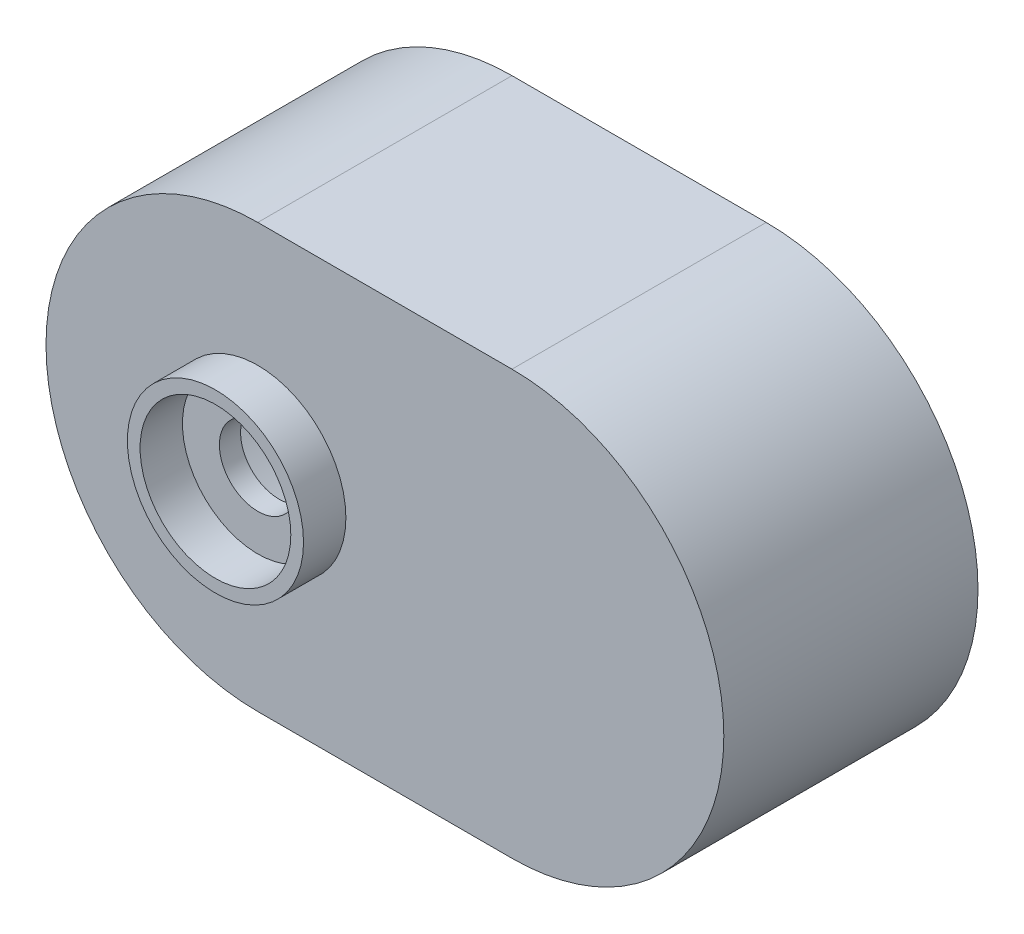
ISO-10303-21;
HEADER;
FILE_DESCRIPTION(('STEP AP214'),'2;1');
FILE_NAME('part.step','',(''),(''),'','','');
FILE_SCHEMA(('AUTOMOTIVE_DESIGN { 1 0 10303 214 1 1 1 1 }'));
ENDSEC;
DATA;
#1=APPLICATION_CONTEXT('core data for automotive mechanical design processes');
#2=APPLICATION_PROTOCOL_DEFINITION('international standard','automotive_design',2000,#1);
#3=PRODUCT_CONTEXT('',#1,'mechanical');
#4=PRODUCT('Part','Part','',(#3));
#5=PRODUCT_RELATED_PRODUCT_CATEGORY('part','',(#4));
#6=PRODUCT_DEFINITION_FORMATION('','',#4);
#7=PRODUCT_DEFINITION_CONTEXT('part definition',#1,'design');
#8=PRODUCT_DEFINITION('design','',#6,#7);
#9=PRODUCT_DEFINITION_SHAPE('','',#8);
#10=(LENGTH_UNIT() NAMED_UNIT(*) SI_UNIT(.MILLI.,.METRE.));
#11=(NAMED_UNIT(*) PLANE_ANGLE_UNIT() SI_UNIT($,.RADIAN.));
#12=(NAMED_UNIT(*) SI_UNIT($,.STERADIAN.) SOLID_ANGLE_UNIT());
#13=UNCERTAINTY_MEASURE_WITH_UNIT(LENGTH_MEASURE(1.E-05),#10,'distance_accuracy_value','');
#14=(GEOMETRIC_REPRESENTATION_CONTEXT(3) GLOBAL_UNCERTAINTY_ASSIGNED_CONTEXT((#13)) GLOBAL_UNIT_ASSIGNED_CONTEXT((#10,
#11,#12)) REPRESENTATION_CONTEXT('',''));
#15=CARTESIAN_POINT('',(0.,0.,0.));
#16=DIRECTION('',(0.,0.,1.));
#17=DIRECTION('',(1.,0.,0.));
#18=AXIS2_PLACEMENT_3D('',#15,#16,#17);
#19=CARTESIAN_POINT('',(0.,0.,60.));
#20=DIRECTION('',(0.,0.,-1.));
#21=DIRECTION('',(-1.,0.,0.));
#22=AXIS2_PLACEMENT_3D('',#19,#20,#21);
#23=CYLINDRICAL_SURFACE('',#22,50.);
#24=CARTESIAN_POINT('',(0.,0.,0.));
#25=DIRECTION('',(0.,0.,1.));
#26=DIRECTION('',(1.,0.,0.));
#27=AXIS2_PLACEMENT_3D('',#24,#25,#26);
#28=CIRCLE('',#27,50.);
#29=CARTESIAN_POINT('',(0.,50.,0.));
#30=VERTEX_POINT('',#29);
#31=CARTESIAN_POINT('',(0.,-50.,0.));
#32=VERTEX_POINT('',#31);
#33=EDGE_CURVE('E170',#30,#32,#28,.T.);
#34=ORIENTED_EDGE('',*,*,#33,.T.);
#35=DIRECTION('',(0.,0.,-1.));
#36=VECTOR('',#35,1.);
#37=CARTESIAN_POINT('',(0.,-50.,60.));
#38=LINE('',#37,#36);
#39=CARTESIAN_POINT('',(0.,-50.,60.));
#40=VERTEX_POINT('',#39);
#41=EDGE_CURVE('E54',#40,#32,#38,.T.);
#42=ORIENTED_EDGE('',*,*,#41,.F.);
#43=CARTESIAN_POINT('',(0.,0.,60.));
#44=DIRECTION('',(0.,0.,1.));
#45=DIRECTION('',(1.,0.,0.));
#46=AXIS2_PLACEMENT_3D('',#43,#44,#45);
#47=CIRCLE('',#46,50.);
#48=CARTESIAN_POINT('',(0.,50.,60.));
#49=VERTEX_POINT('',#48);
#50=EDGE_CURVE('E176',#49,#40,#47,.T.);
#51=ORIENTED_EDGE('',*,*,#50,.F.);
#52=DIRECTION('',(0.,0.,-1.));
#53=VECTOR('',#52,1.);
#54=CARTESIAN_POINT('',(0.,50.,60.));
#55=LINE('',#54,#53);
#56=EDGE_CURVE('E186',#49,#30,#55,.T.);
#57=ORIENTED_EDGE('',*,*,#56,.T.);
#58=EDGE_LOOP('',(#34,#42,#51,#57));
#59=FACE_BOUND('',#58,.T.);
#60=ADVANCED_FACE('F45',(#59),#23,.T.);
#61=CARTESIAN_POINT('',(0.,-50.,60.));
#62=DIRECTION('',(0.,1.,0.));
#63=DIRECTION('',(0.,0.,1.));
#64=AXIS2_PLACEMENT_3D('',#61,#62,#63);
#65=PLANE('',#64);
#66=DIRECTION('',(1.,0.,0.));
#67=VECTOR('',#66,1.);
#68=CARTESIAN_POINT('',(0.,-50.,0.));
#69=LINE('',#68,#67);
#70=CARTESIAN_POINT('',(60.,-50.,0.));
#71=VERTEX_POINT('',#70);
#72=EDGE_CURVE('E190',#32,#71,#69,.T.);
#73=ORIENTED_EDGE('',*,*,#72,.T.);
#74=DIRECTION('',(0.,0.,-1.));
#75=VECTOR('',#74,1.);
#76=CARTESIAN_POINT('',(60.,-50.,60.));
#77=LINE('',#76,#75);
#78=CARTESIAN_POINT('',(60.,-50.,60.));
#79=VERTEX_POINT('',#78);
#80=EDGE_CURVE('E203',#79,#71,#77,.T.);
#81=ORIENTED_EDGE('',*,*,#80,.F.);
#82=DIRECTION('',(1.,0.,0.));
#83=VECTOR('',#82,1.);
#84=CARTESIAN_POINT('',(0.,-50.,60.));
#85=LINE('',#84,#83);
#86=EDGE_CURVE('E99',#40,#79,#85,.T.);
#87=ORIENTED_EDGE('',*,*,#86,.F.);
#88=ORIENTED_EDGE('',*,*,#41,.T.);
#89=EDGE_LOOP('',(#73,#81,#87,#88));
#90=FACE_BOUND('',#89,.T.);
#91=ADVANCED_FACE('F209',(#90),#65,.F.);
#92=CARTESIAN_POINT('',(60.,0.,60.));
#93=DIRECTION('',(0.,0.,-1.));
#94=DIRECTION('',(-1.,0.,0.));
#95=AXIS2_PLACEMENT_3D('',#92,#93,#94);
#96=CYLINDRICAL_SURFACE('',#95,50.);
#97=CARTESIAN_POINT('',(60.,0.,0.));
#98=DIRECTION('',(0.,0.,1.));
#99=DIRECTION('',(1.,0.,0.));
#100=AXIS2_PLACEMENT_3D('',#97,#98,#99);
#101=CIRCLE('',#100,50.);
#102=CARTESIAN_POINT('',(60.,50.,0.));
#103=VERTEX_POINT('',#102);
#104=EDGE_CURVE('E193',#71,#103,#101,.T.);
#105=ORIENTED_EDGE('',*,*,#104,.T.);
#106=DIRECTION('',(0.,0.,-1.));
#107=VECTOR('',#106,1.);
#108=CARTESIAN_POINT('',(60.,50.,60.));
#109=LINE('',#108,#107);
#110=CARTESIAN_POINT('',(60.,50.,60.));
#111=VERTEX_POINT('',#110);
#112=EDGE_CURVE('E200',#111,#103,#109,.T.);
#113=ORIENTED_EDGE('',*,*,#112,.F.);
#114=CARTESIAN_POINT('',(60.,0.,60.));
#115=DIRECTION('',(0.,0.,1.));
#116=DIRECTION('',(1.,0.,0.));
#117=AXIS2_PLACEMENT_3D('',#114,#115,#116);
#118=CIRCLE('',#117,50.);
#119=EDGE_CURVE('E181',#79,#111,#118,.T.);
#120=ORIENTED_EDGE('',*,*,#119,.F.);
#121=ORIENTED_EDGE('',*,*,#80,.T.);
#122=EDGE_LOOP('',(#105,#113,#120,#121));
#123=FACE_BOUND('',#122,.T.);
#124=ADVANCED_FACE('F218',(#123),#96,.T.);
#125=CARTESIAN_POINT('',(0.,50.,60.));
#126=DIRECTION('',(0.,-1.,0.));
#127=DIRECTION('',(0.,0.,-1.));
#128=AXIS2_PLACEMENT_3D('',#125,#126,#127);
#129=PLANE('',#128);
#130=DIRECTION('',(-1.,0.,0.));
#131=VECTOR('',#130,1.);
#132=CARTESIAN_POINT('',(0.,50.,0.));
#133=LINE('',#132,#131);
#134=EDGE_CURVE('E91',#103,#30,#133,.T.);
#135=ORIENTED_EDGE('',*,*,#134,.T.);
#136=ORIENTED_EDGE('',*,*,#56,.F.);
#137=DIRECTION('',(-1.,0.,0.));
#138=VECTOR('',#137,1.);
#139=CARTESIAN_POINT('',(0.,50.,60.));
#140=LINE('',#139,#138);
#141=EDGE_CURVE('E70',#111,#49,#140,.T.);
#142=ORIENTED_EDGE('',*,*,#141,.F.);
#143=ORIENTED_EDGE('',*,*,#112,.T.);
#144=EDGE_LOOP('',(#135,#136,#142,#143));
#145=FACE_BOUND('',#144,.T.);
#146=ADVANCED_FACE('F220',(#145),#129,.F.);
#147=CARTESIAN_POINT('',(0.,0.,60.));
#148=DIRECTION('',(0.,0.,1.));
#149=DIRECTION('',(1.,0.,0.));
#150=AXIS2_PLACEMENT_3D('',#147,#148,#149);
#151=PLANE('',#150);
#152=CARTESIAN_POINT('',(0.,0.,60.));
#153=DIRECTION('',(0.,0.,1.));
#154=DIRECTION('',(1.,0.,0.));
#155=AXIS2_PLACEMENT_3D('',#152,#153,#154);
#156=CIRCLE('',#155,20.7891455542348);
#157=CARTESIAN_POINT('',(20.7891455542348,0.,60.));
#158=VERTEX_POINT('',#157);
#159=EDGE_CURVE('E151',#158,#158,#156,.T.);
#160=ORIENTED_EDGE('',*,*,#159,.F.);
#161=EDGE_LOOP('',(#160));
#162=FACE_BOUND('',#161,.T.);
#163=ORIENTED_EDGE('',*,*,#50,.T.);
#164=ORIENTED_EDGE('',*,*,#86,.T.);
#165=ORIENTED_EDGE('',*,*,#119,.T.);
#166=ORIENTED_EDGE('',*,*,#141,.T.);
#167=EDGE_LOOP('',(#163,#164,#165,#166));
#168=FACE_BOUND('',#167,.T.);
#169=ADVANCED_FACE('F221',(#162,#168),#151,.T.);
#170=CARTESIAN_POINT('',(0.,0.,0.));
#171=DIRECTION('',(0.,0.,1.));
#172=DIRECTION('',(1.,0.,0.));
#173=AXIS2_PLACEMENT_3D('',#170,#171,#172);
#174=PLANE('',#173);
#175=CARTESIAN_POINT('',(0.,0.,0.));
#176=DIRECTION('',(0.,0.,-1.));
#177=DIRECTION('',(-1.,0.,0.));
#178=AXIS2_PLACEMENT_3D('',#175,#176,#177);
#179=CIRCLE('',#178,47.);
#180=CARTESIAN_POINT('',(0.,-47.,0.));
#181=VERTEX_POINT('',#180);
#182=CARTESIAN_POINT('',(0.,47.,0.));
#183=VERTEX_POINT('',#182);
#184=EDGE_CURVE('E160',#181,#183,#179,.T.);
#185=ORIENTED_EDGE('',*,*,#184,.F.);
#186=DIRECTION('',(-1.,0.,0.));
#187=VECTOR('',#186,1.);
#188=CARTESIAN_POINT('',(0.,-47.,0.));
#189=LINE('',#188,#187);
#190=CARTESIAN_POINT('',(60.,-47.,0.));
#191=VERTEX_POINT('',#190);
#192=EDGE_CURVE('E61',#191,#181,#189,.T.);
#193=ORIENTED_EDGE('',*,*,#192,.F.);
#194=CARTESIAN_POINT('',(60.,0.,0.));
#195=DIRECTION('',(0.,0.,-1.));
#196=DIRECTION('',(-1.,0.,0.));
#197=AXIS2_PLACEMENT_3D('',#194,#195,#196);
#198=CIRCLE('',#197,47.);
#199=CARTESIAN_POINT('',(60.,47.,0.));
#200=VERTEX_POINT('',#199);
#201=EDGE_CURVE('E144',#200,#191,#198,.T.);
#202=ORIENTED_EDGE('',*,*,#201,.F.);
#203=DIRECTION('',(1.,0.,0.));
#204=VECTOR('',#203,1.);
#205=CARTESIAN_POINT('',(0.,47.,0.));
#206=LINE('',#205,#204);
#207=EDGE_CURVE('E148',#183,#200,#206,.T.);
#208=ORIENTED_EDGE('',*,*,#207,.F.);
#209=EDGE_LOOP('',(#185,#193,#202,#208));
#210=FACE_BOUND('',#209,.T.);
#211=ORIENTED_EDGE('',*,*,#33,.F.);
#212=ORIENTED_EDGE('',*,*,#134,.F.);
#213=ORIENTED_EDGE('',*,*,#104,.F.);
#214=ORIENTED_EDGE('',*,*,#72,.F.);
#215=EDGE_LOOP('',(#211,#212,#213,#214));
#216=FACE_BOUND('',#215,.T.);
#217=ADVANCED_FACE('F214',(#210,#216),#174,.F.);
#218=CARTESIAN_POINT('',(0.,-47.,55.));
#219=DIRECTION('',(0.,-1.,0.));
#220=DIRECTION('',(0.,0.,-1.));
#221=AXIS2_PLACEMENT_3D('',#218,#219,#220);
#222=PLANE('',#221);
#223=ORIENTED_EDGE('',*,*,#192,.T.);
#224=DIRECTION('',(0.,0.,-1.));
#225=VECTOR('',#224,1.);
#226=CARTESIAN_POINT('',(0.,-47.,55.));
#227=LINE('',#226,#225);
#228=CARTESIAN_POINT('',(0.,-47.,55.));
#229=VERTEX_POINT('',#228);
#230=EDGE_CURVE('E119',#229,#181,#227,.T.);
#231=ORIENTED_EDGE('',*,*,#230,.F.);
#232=DIRECTION('',(-1.,0.,0.));
#233=VECTOR('',#232,1.);
#234=CARTESIAN_POINT('',(0.,-47.,55.));
#235=LINE('',#234,#233);
#236=CARTESIAN_POINT('',(60.,-47.,55.));
#237=VERTEX_POINT('',#236);
#238=EDGE_CURVE('E123',#237,#229,#235,.T.);
#239=ORIENTED_EDGE('',*,*,#238,.F.);
#240=DIRECTION('',(0.,0.,-1.));
#241=VECTOR('',#240,1.);
#242=CARTESIAN_POINT('',(60.,-47.,55.));
#243=LINE('',#242,#241);
#244=EDGE_CURVE('E167',#237,#191,#243,.T.);
#245=ORIENTED_EDGE('',*,*,#244,.T.);
#246=EDGE_LOOP('',(#223,#231,#239,#245));
#247=FACE_BOUND('',#246,.T.);
#248=ADVANCED_FACE('F121',(#247),#222,.F.);
#249=CARTESIAN_POINT('',(60.,0.,55.));
#250=DIRECTION('',(0.,0.,-1.));
#251=DIRECTION('',(-1.,0.,0.));
#252=AXIS2_PLACEMENT_3D('',#249,#250,#251);
#253=CYLINDRICAL_SURFACE('',#252,47.);
#254=ORIENTED_EDGE('',*,*,#201,.T.);
#255=ORIENTED_EDGE('',*,*,#244,.F.);
#256=CARTESIAN_POINT('',(60.,0.,55.));
#257=DIRECTION('',(0.,0.,-1.));
#258=DIRECTION('',(-1.,0.,0.));
#259=AXIS2_PLACEMENT_3D('',#256,#257,#258);
#260=CIRCLE('',#259,47.);
#261=CARTESIAN_POINT('',(60.,47.,55.));
#262=VERTEX_POINT('',#261);
#263=EDGE_CURVE('E130',#262,#237,#260,.T.);
#264=ORIENTED_EDGE('',*,*,#263,.F.);
#265=DIRECTION('',(0.,0.,-1.));
#266=VECTOR('',#265,1.);
#267=CARTESIAN_POINT('',(60.,47.,55.));
#268=LINE('',#267,#266);
#269=EDGE_CURVE('E171',#262,#200,#268,.T.);
#270=ORIENTED_EDGE('',*,*,#269,.T.);
#271=EDGE_LOOP('',(#254,#255,#264,#270));
#272=FACE_BOUND('',#271,.T.);
#273=ADVANCED_FACE('F271',(#272),#253,.F.);
#274=CARTESIAN_POINT('',(0.,47.,55.));
#275=DIRECTION('',(0.,1.,0.));
#276=DIRECTION('',(0.,0.,1.));
#277=AXIS2_PLACEMENT_3D('',#274,#275,#276);
#278=PLANE('',#277);
#279=ORIENTED_EDGE('',*,*,#207,.T.);
#280=ORIENTED_EDGE('',*,*,#269,.F.);
#281=DIRECTION('',(1.,0.,0.));
#282=VECTOR('',#281,1.);
#283=CARTESIAN_POINT('',(0.,47.,55.));
#284=LINE('',#283,#282);
#285=CARTESIAN_POINT('',(0.,47.,55.));
#286=VERTEX_POINT('',#285);
#287=EDGE_CURVE('E139',#286,#262,#284,.T.);
#288=ORIENTED_EDGE('',*,*,#287,.F.);
#289=DIRECTION('',(0.,0.,-1.));
#290=VECTOR('',#289,1.);
#291=CARTESIAN_POINT('',(0.,47.,55.));
#292=LINE('',#291,#290);
#293=EDGE_CURVE('E129',#286,#183,#292,.T.);
#294=ORIENTED_EDGE('',*,*,#293,.T.);
#295=EDGE_LOOP('',(#279,#280,#288,#294));
#296=FACE_BOUND('',#295,.T.);
#297=ADVANCED_FACE('F280',(#296),#278,.F.);
#298=CARTESIAN_POINT('',(0.,0.,55.));
#299=DIRECTION('',(0.,0.,-1.));
#300=DIRECTION('',(-1.,0.,0.));
#301=AXIS2_PLACEMENT_3D('',#298,#299,#300);
#302=CYLINDRICAL_SURFACE('',#301,47.);
#303=ORIENTED_EDGE('',*,*,#184,.T.);
#304=ORIENTED_EDGE('',*,*,#293,.F.);
#305=CARTESIAN_POINT('',(0.,0.,55.));
#306=DIRECTION('',(0.,0.,-1.));
#307=DIRECTION('',(-1.,0.,0.));
#308=AXIS2_PLACEMENT_3D('',#305,#306,#307);
#309=CIRCLE('',#308,47.);
#310=EDGE_CURVE('E133',#229,#286,#309,.T.);
#311=ORIENTED_EDGE('',*,*,#310,.F.);
#312=ORIENTED_EDGE('',*,*,#230,.T.);
#313=EDGE_LOOP('',(#303,#304,#311,#312));
#314=FACE_BOUND('',#313,.T.);
#315=ADVANCED_FACE('F134',(#314),#302,.F.);
#316=CARTESIAN_POINT('',(0.,0.,55.));
#317=DIRECTION('',(0.,0.,-1.));
#318=DIRECTION('',(-1.,0.,0.));
#319=AXIS2_PLACEMENT_3D('',#316,#317,#318);
#320=PLANE('',#319);
#321=CARTESIAN_POINT('',(0.,0.,55.));
#322=DIRECTION('',(0.,0.,-1.));
#323=DIRECTION('',(-1.,0.,0.));
#324=AXIS2_PLACEMENT_3D('',#321,#322,#323);
#325=CIRCLE('',#324,9.07220859637889);
#326=CARTESIAN_POINT('',(-9.07220859637889,0.,55.));
#327=VERTEX_POINT('',#326);
#328=EDGE_CURVE('E48',#327,#327,#325,.T.);
#329=ORIENTED_EDGE('',*,*,#328,.F.);
#330=EDGE_LOOP('',(#329));
#331=FACE_BOUND('',#330,.T.);
#332=ORIENTED_EDGE('',*,*,#238,.T.);
#333=ORIENTED_EDGE('',*,*,#310,.T.);
#334=ORIENTED_EDGE('',*,*,#287,.T.);
#335=ORIENTED_EDGE('',*,*,#263,.T.);
#336=EDGE_LOOP('',(#332,#333,#334,#335));
#337=FACE_BOUND('',#336,.T.);
#338=ADVANCED_FACE('F141',(#331,#337),#320,.T.);
#339=CARTESIAN_POINT('',(0.,0.,70.));
#340=DIRECTION('',(0.,0.,-1.));
#341=DIRECTION('',(-1.,0.,0.));
#342=AXIS2_PLACEMENT_3D('',#339,#340,#341);
#343=CYLINDRICAL_SURFACE('',#342,17.7891455542348);
#344=CARTESIAN_POINT('',(0.,0.,70.));
#345=DIRECTION('',(0.,0.,1.));
#346=DIRECTION('',(1.,0.,0.));
#347=AXIS2_PLACEMENT_3D('',#344,#345,#346);
#348=CIRCLE('',#347,17.7891455542348);
#349=CARTESIAN_POINT('',(17.7891455542348,0.,70.));
#350=VERTEX_POINT('',#349);
#351=EDGE_CURVE('E407',#350,#350,#348,.T.);
#352=ORIENTED_EDGE('',*,*,#351,.T.);
#353=EDGE_LOOP('',(#352));
#354=FACE_BOUND('',#353,.T.);
#355=CARTESIAN_POINT('',(0.,0.,60.));
#356=DIRECTION('',(0.,0.,1.));
#357=DIRECTION('',(1.,0.,0.));
#358=AXIS2_PLACEMENT_3D('',#355,#356,#357);
#359=CIRCLE('',#358,17.7891455542348);
#360=CARTESIAN_POINT('',(17.7891455542348,0.,60.));
#361=VERTEX_POINT('',#360);
#362=EDGE_CURVE('E11',#361,#361,#359,.F.);
#363=ORIENTED_EDGE('',*,*,#362,.T.);
#364=EDGE_LOOP('',(#363));
#365=FACE_BOUND('',#364,.T.);
#366=ADVANCED_FACE('F312',(#354,#365),#343,.F.);
#367=CARTESIAN_POINT('',(0.,0.,70.));
#368=DIRECTION('',(0.,0.,-1.));
#369=DIRECTION('',(-1.,0.,0.));
#370=AXIS2_PLACEMENT_3D('',#367,#368,#369);
#371=CYLINDRICAL_SURFACE('',#370,20.7891455542348);
#372=CARTESIAN_POINT('',(0.,0.,70.));
#373=DIRECTION('',(0.,0.,1.));
#374=DIRECTION('',(1.,0.,0.));
#375=AXIS2_PLACEMENT_3D('',#372,#373,#374);
#376=CIRCLE('',#375,20.7891455542348);
#377=CARTESIAN_POINT('',(20.7891455542348,0.,70.));
#378=VERTEX_POINT('',#377);
#379=EDGE_CURVE('E161',#378,#378,#376,.T.);
#380=ORIENTED_EDGE('',*,*,#379,.F.);
#381=EDGE_LOOP('',(#380));
#382=FACE_BOUND('',#381,.T.);
#383=ORIENTED_EDGE('',*,*,#159,.T.);
#384=EDGE_LOOP('',(#383));
#385=FACE_BOUND('',#384,.T.);
#386=ADVANCED_FACE('F317',(#382,#385),#371,.T.);
#387=CARTESIAN_POINT('',(0.,0.,70.));
#388=DIRECTION('',(0.,0.,1.));
#389=DIRECTION('',(1.,0.,0.));
#390=AXIS2_PLACEMENT_3D('',#387,#388,#389);
#391=PLANE('',#390);
#392=ORIENTED_EDGE('',*,*,#351,.F.);
#393=EDGE_LOOP('',(#392));
#394=FACE_BOUND('',#393,.T.);
#395=ORIENTED_EDGE('',*,*,#379,.T.);
#396=EDGE_LOOP('',(#395));
#397=FACE_BOUND('',#396,.T.);
#398=ADVANCED_FACE('F237',(#394,#397),#391,.T.);
#399=CARTESIAN_POINT('',(0.,0.,60.));
#400=DIRECTION('',(0.,0.,1.));
#401=DIRECTION('',(1.,0.,0.));
#402=AXIS2_PLACEMENT_3D('',#399,#400,#401);
#403=CIRCLE('',#402,9.07220859637889);
#404=CARTESIAN_POINT('',(9.07220859637889,0.,60.));
#405=VERTEX_POINT('',#404);
#406=EDGE_CURVE('E402',#405,#405,#403,.T.);
#407=ORIENTED_EDGE('',*,*,#406,.F.);
#408=EDGE_LOOP('',(#407));
#409=FACE_BOUND('',#408,.T.);
#410=ORIENTED_EDGE('',*,*,#362,.F.);
#411=EDGE_LOOP('',(#410));
#412=FACE_BOUND('',#411,.T.);
#413=ADVANCED_FACE('F225',(#409,#412),#151,.T.);
#414=CARTESIAN_POINT('',(0.,0.,0.));
#415=DIRECTION('',(0.,0.,1.));
#416=DIRECTION('',(1.,0.,0.));
#417=AXIS2_PLACEMENT_3D('',#414,#415,#416);
#418=CYLINDRICAL_SURFACE('',#417,9.07220859637889);
#419=ORIENTED_EDGE('',*,*,#328,.T.);
#420=EDGE_LOOP('',(#419));
#421=FACE_BOUND('',#420,.T.);
#422=ORIENTED_EDGE('',*,*,#406,.T.);
#423=EDGE_LOOP('',(#422));
#424=FACE_BOUND('',#423,.T.);
#425=ADVANCED_FACE('F236',(#421,#424),#418,.F.);
#426=CLOSED_SHELL('',(#60,#91,#124,#146,#169,#217,#248,#273,#297,#315,#338,#366,#386,#398,#413,#425));
#427=MANIFOLD_SOLID_BREP('B2',#426);
#428=ADVANCED_BREP_SHAPE_REPRESENTATION('',(#18,#427),#14);
#429=SHAPE_DEFINITION_REPRESENTATION(#9,#428);
ENDSEC;
END-ISO-10303-21;
